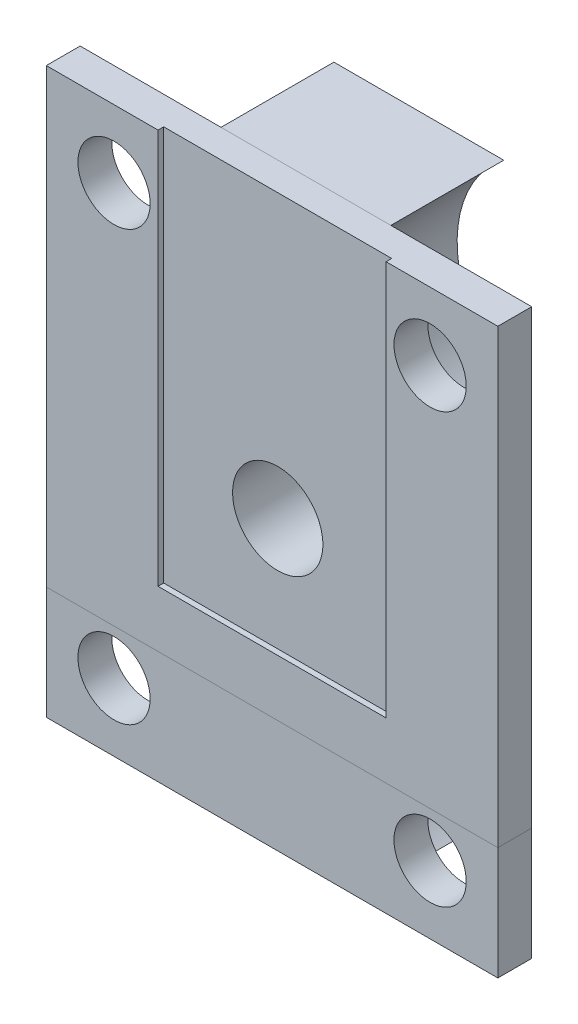
ISO-10303-21;
HEADER;
FILE_DESCRIPTION(('STEP AP214'),'2;1');
FILE_NAME('part.step','',(''),(''),'','','');
FILE_SCHEMA(('AUTOMOTIVE_DESIGN { 1 0 10303 214 1 1 1 1 }'));
ENDSEC;
DATA;
#1=APPLICATION_CONTEXT('core data for automotive mechanical design processes');
#2=APPLICATION_PROTOCOL_DEFINITION('international standard','automotive_design',2000,#1);
#3=PRODUCT_CONTEXT('',#1,'mechanical');
#4=PRODUCT('Part','Part','',(#3));
#5=PRODUCT_RELATED_PRODUCT_CATEGORY('part','',(#4));
#6=PRODUCT_DEFINITION_FORMATION('','',#4);
#7=PRODUCT_DEFINITION_CONTEXT('part definition',#1,'design');
#8=PRODUCT_DEFINITION('design','',#6,#7);
#9=PRODUCT_DEFINITION_SHAPE('','',#8);
#10=(LENGTH_UNIT() NAMED_UNIT(*) SI_UNIT(.MILLI.,.METRE.));
#11=(NAMED_UNIT(*) PLANE_ANGLE_UNIT() SI_UNIT($,.RADIAN.));
#12=(NAMED_UNIT(*) SI_UNIT($,.STERADIAN.) SOLID_ANGLE_UNIT());
#13=UNCERTAINTY_MEASURE_WITH_UNIT(LENGTH_MEASURE(1.E-05),#10,'distance_accuracy_value','');
#14=(GEOMETRIC_REPRESENTATION_CONTEXT(3) GLOBAL_UNCERTAINTY_ASSIGNED_CONTEXT((#13)) GLOBAL_UNIT_ASSIGNED_CONTEXT((#10,
#11,#12)) REPRESENTATION_CONTEXT('',''));
#15=CARTESIAN_POINT('',(0.,0.,0.));
#16=DIRECTION('',(0.,0.,1.));
#17=DIRECTION('',(1.,0.,0.));
#18=AXIS2_PLACEMENT_3D('',#15,#16,#17);
#19=CARTESIAN_POINT('',(0.,-7.5,-5.5));
#20=DIRECTION('',(0.,0.,1.));
#21=DIRECTION('',(1.,0.,0.));
#22=AXIS2_PLACEMENT_3D('',#19,#20,#21);
#23=PLANE('',#22);
#24=CARTESIAN_POINT('',(0.,-2.5,-5.5));
#25=DIRECTION('',(0.,0.,-1.));
#26=DIRECTION('',(-1.,0.,0.));
#27=AXIS2_PLACEMENT_3D('',#24,#25,#26);
#28=CIRCLE('',#27,1.35);
#29=CARTESIAN_POINT('',(-1.35,-2.5,-5.5));
#30=VERTEX_POINT('',#29);
#31=EDGE_CURVE('P0_E146',#30,#30,#28,.T.);
#32=ORIENTED_EDGE('',*,*,#31,.T.);
#33=EDGE_LOOP('',(#32));
#34=FACE_BOUND('',#33,.T.);
#35=CARTESIAN_POINT('',(0.,-2.5,-5.5));
#36=DIRECTION('',(0.,0.,-1.));
#37=DIRECTION('',(-1.,0.,0.));
#38=AXIS2_PLACEMENT_3D('',#35,#36,#37);
#39=CIRCLE('',#38,2.);
#40=CARTESIAN_POINT('',(-2.,-2.5,-5.5));
#41=VERTEX_POINT('',#40);
#42=EDGE_CURVE('P0_E19',#41,#41,#39,.F.);
#43=ORIENTED_EDGE('',*,*,#42,.T.);
#44=EDGE_LOOP('',(#43));
#45=FACE_BOUND('',#44,.T.);
#46=ADVANCED_FACE('P0_F16',(#34,#45),#23,.T.);
#47=CARTESIAN_POINT('',(0.,-2.5,-1.5));
#48=DIRECTION('',(0.,0.,-1.));
#49=DIRECTION('',(-1.,0.,0.));
#50=AXIS2_PLACEMENT_3D('',#47,#48,#49);
#51=CYLINDRICAL_SURFACE('',#50,2.);
#52=ORIENTED_EDGE('',*,*,#42,.F.);
#53=EDGE_LOOP('',(#52));
#54=FACE_BOUND('',#53,.T.);
#55=CARTESIAN_POINT('',(0.,-2.5,-0.25));
#56=DIRECTION('',(0.,0.,-1.));
#57=DIRECTION('',(-1.,0.,0.));
#58=AXIS2_PLACEMENT_3D('',#55,#56,#57);
#59=CIRCLE('',#58,2.);
#60=CARTESIAN_POINT('',(-2.,-2.5,-0.25));
#61=VERTEX_POINT('',#60);
#62=EDGE_CURVE('P0_E137',#61,#61,#59,.F.);
#63=ORIENTED_EDGE('',*,*,#62,.T.);
#64=EDGE_LOOP('',(#63));
#65=FACE_BOUND('',#64,.T.);
#66=ADVANCED_FACE('P0_F181',(#54,#65),#51,.F.);
#67=CARTESIAN_POINT('',(0.,-2.5,-6.5));
#68=DIRECTION('',(0.,0.,-1.));
#69=DIRECTION('',(-1.,0.,0.));
#70=AXIS2_PLACEMENT_3D('',#67,#68,#69);
#71=CYLINDRICAL_SURFACE('',#70,1.35);
#72=CARTESIAN_POINT('',(0.,-2.5,-6.5));
#73=DIRECTION('',(0.,0.,-1.));
#74=DIRECTION('',(-1.,0.,0.));
#75=AXIS2_PLACEMENT_3D('',#72,#73,#74);
#76=CIRCLE('',#75,1.35);
#77=CARTESIAN_POINT('',(-1.35,-2.5,-6.5));
#78=VERTEX_POINT('',#77);
#79=EDGE_CURVE('P0_E162',#78,#78,#76,.F.);
#80=ORIENTED_EDGE('',*,*,#79,.F.);
#81=EDGE_LOOP('',(#80));
#82=FACE_BOUND('',#81,.T.);
#83=ORIENTED_EDGE('',*,*,#31,.F.);
#84=EDGE_LOOP('',(#83));
#85=FACE_BOUND('',#84,.T.);
#86=ADVANCED_FACE('P0_F184',(#82,#85),#71,.F.);
#87=CARTESIAN_POINT('',(5.05,10.,0.25));
#88=DIRECTION('',(1.,0.,0.));
#89=DIRECTION('',(0.,0.,-1.));
#90=AXIS2_PLACEMENT_3D('',#87,#88,#89);
#91=PLANE('',#90);
#92=DIRECTION('',(0.,1.,0.));
#93=VECTOR('',#92,1.);
#94=CARTESIAN_POINT('',(5.05,10.,-0.25));
#95=LINE('',#94,#93);
#96=CARTESIAN_POINT('',(5.05,10.,-0.25));
#97=VERTEX_POINT('',#96);
#98=CARTESIAN_POINT('',(5.05,-7.5,-0.25));
#99=VERTEX_POINT('',#98);
#100=EDGE_CURVE('P0_E108',#97,#99,#95,.F.);
#101=ORIENTED_EDGE('',*,*,#100,.T.);
#102=DIRECTION('',(0.,0.,1.));
#103=VECTOR('',#102,1.);
#104=CARTESIAN_POINT('',(5.05,-7.5,0.));
#105=LINE('',#104,#103);
#106=CARTESIAN_POINT('',(5.05,-7.5,0.));
#107=VERTEX_POINT('',#106);
#108=EDGE_CURVE('P0_E111',#107,#99,#105,.F.);
#109=ORIENTED_EDGE('',*,*,#108,.F.);
#110=DIRECTION('',(0.,1.,0.));
#111=VECTOR('',#110,1.);
#112=CARTESIAN_POINT('',(5.05,0.,0.));
#113=LINE('',#112,#111);
#114=CARTESIAN_POINT('',(5.05,10.,0.));
#115=VERTEX_POINT('',#114);
#116=EDGE_CURVE('P0_E166',#115,#107,#113,.F.);
#117=ORIENTED_EDGE('',*,*,#116,.F.);
#118=DIRECTION('',(0.,0.,-1.));
#119=VECTOR('',#118,1.);
#120=CARTESIAN_POINT('',(5.05,10.,0.25));
#121=LINE('',#120,#119);
#122=EDGE_CURVE('P0_E113',#97,#115,#121,.F.);
#123=ORIENTED_EDGE('',*,*,#122,.F.);
#124=EDGE_LOOP('',(#101,#109,#117,#123));
#125=FACE_BOUND('',#124,.T.);
#126=ADVANCED_FACE('P0_F109',(#125),#91,.F.);
#127=CARTESIAN_POINT('',(0.,-7.5,0.));
#128=DIRECTION('',(0.,1.,0.));
#129=DIRECTION('',(0.,0.,1.));
#130=AXIS2_PLACEMENT_3D('',#127,#128,#129);
#131=PLANE('',#130);
#132=DIRECTION('',(0.,0.,1.));
#133=VECTOR('',#132,1.);
#134=CARTESIAN_POINT('',(-5.05,-7.5,-0.25));
#135=LINE('',#134,#133);
#136=CARTESIAN_POINT('',(-5.05,-7.5,-0.25));
#137=VERTEX_POINT('',#136);
#138=CARTESIAN_POINT('',(-5.05,-7.5,0.));
#139=VERTEX_POINT('',#138);
#140=EDGE_CURVE('P0_E118',#137,#139,#135,.T.);
#141=ORIENTED_EDGE('',*,*,#140,.T.);
#142=DIRECTION('',(1.,0.,0.));
#143=VECTOR('',#142,1.);
#144=CARTESIAN_POINT('',(0.,-7.5,0.));
#145=LINE('',#144,#143);
#146=EDGE_CURVE('P0_E122',#107,#139,#145,.F.);
#147=ORIENTED_EDGE('',*,*,#146,.F.);
#148=ORIENTED_EDGE('',*,*,#108,.T.);
#149=DIRECTION('',(-1.,0.,0.));
#150=VECTOR('',#149,1.);
#151=CARTESIAN_POINT('',(5.05,-7.5,-0.25));
#152=LINE('',#151,#150);
#153=EDGE_CURVE('P0_E103',#99,#137,#152,.T.);
#154=ORIENTED_EDGE('',*,*,#153,.T.);
#155=EDGE_LOOP('',(#141,#147,#148,#154));
#156=FACE_BOUND('',#155,.T.);
#157=ADVANCED_FACE('P0_F120',(#156),#131,.T.);
#158=CARTESIAN_POINT('',(-5.05,10.,-0.25));
#159=DIRECTION('',(-1.,0.,0.));
#160=DIRECTION('',(0.,0.,1.));
#161=AXIS2_PLACEMENT_3D('',#158,#159,#160);
#162=PLANE('',#161);
#163=DIRECTION('',(0.,1.,0.));
#164=VECTOR('',#163,1.);
#165=CARTESIAN_POINT('',(-5.05,10.,-0.25));
#166=LINE('',#165,#164);
#167=CARTESIAN_POINT('',(-5.05,10.,-0.25));
#168=VERTEX_POINT('',#167);
#169=EDGE_CURVE('P0_E130',#137,#168,#166,.T.);
#170=ORIENTED_EDGE('',*,*,#169,.T.);
#171=DIRECTION('',(0.,0.,1.));
#172=VECTOR('',#171,1.);
#173=CARTESIAN_POINT('',(-5.05,10.,-0.25));
#174=LINE('',#173,#172);
#175=CARTESIAN_POINT('',(-5.05,10.,0.));
#176=VERTEX_POINT('',#175);
#177=EDGE_CURVE('P0_E125',#176,#168,#174,.F.);
#178=ORIENTED_EDGE('',*,*,#177,.F.);
#179=DIRECTION('',(0.,1.,0.));
#180=VECTOR('',#179,1.);
#181=CARTESIAN_POINT('',(-5.05,0.,0.));
#182=LINE('',#181,#180);
#183=EDGE_CURVE('P0_E269',#139,#176,#182,.T.);
#184=ORIENTED_EDGE('',*,*,#183,.F.);
#185=ORIENTED_EDGE('',*,*,#140,.F.);
#186=EDGE_LOOP('',(#170,#178,#184,#185));
#187=FACE_BOUND('',#186,.T.);
#188=ADVANCED_FACE('P0_F189',(#187),#162,.F.);
#189=CARTESIAN_POINT('',(5.05,10.,-0.25));
#190=DIRECTION('',(0.,0.,-1.));
#191=DIRECTION('',(-1.,0.,0.));
#192=AXIS2_PLACEMENT_3D('',#189,#190,#191);
#193=PLANE('',#192);
#194=ORIENTED_EDGE('',*,*,#62,.F.);
#195=EDGE_LOOP('',(#194));
#196=FACE_BOUND('',#195,.T.);
#197=ORIENTED_EDGE('',*,*,#153,.F.);
#198=ORIENTED_EDGE('',*,*,#100,.F.);
#199=DIRECTION('',(1.,0.,0.));
#200=VECTOR('',#199,1.);
#201=CARTESIAN_POINT('',(0.,10.,-0.25));
#202=LINE('',#201,#200);
#203=EDGE_CURVE('P0_E268',#168,#97,#202,.T.);
#204=ORIENTED_EDGE('',*,*,#203,.F.);
#205=ORIENTED_EDGE('',*,*,#169,.F.);
#206=EDGE_LOOP('',(#197,#198,#204,#205));
#207=FACE_BOUND('',#206,.T.);
#208=ADVANCED_FACE('P0_F128',(#196,#207),#193,.F.);
#209=CARTESIAN_POINT('',(0.,-10.,-6.5));
#210=DIRECTION('',(0.,0.,-1.));
#211=DIRECTION('',(-1.,0.,0.));
#212=AXIS2_PLACEMENT_3D('',#209,#210,#211);
#213=PLANE('',#212);
#214=ORIENTED_EDGE('',*,*,#79,.T.);
#215=EDGE_LOOP('',(#214));
#216=FACE_BOUND('',#215,.T.);
#217=DIRECTION('',(0.,1.,0.));
#218=VECTOR('',#217,1.);
#219=CARTESIAN_POINT('',(-4.,-6.5,-6.5));
#220=LINE('',#219,#218);
#221=CARTESIAN_POINT('',(-4.,1.5,-6.5));
#222=VERTEX_POINT('',#221);
#223=CARTESIAN_POINT('',(-4.,-6.5,-6.5));
#224=VERTEX_POINT('',#223);
#225=EDGE_CURVE('P0_E277',#222,#224,#220,.F.);
#226=ORIENTED_EDGE('',*,*,#225,.F.);
#227=DIRECTION('',(1.,0.,0.));
#228=VECTOR('',#227,1.);
#229=CARTESIAN_POINT('',(-4.,1.5,-6.5));
#230=LINE('',#229,#228);
#231=CARTESIAN_POINT('',(4.,1.5,-6.5));
#232=VERTEX_POINT('',#231);
#233=EDGE_CURVE('P0_E324',#232,#222,#230,.F.);
#234=ORIENTED_EDGE('',*,*,#233,.F.);
#235=DIRECTION('',(0.,1.,0.));
#236=VECTOR('',#235,1.);
#237=CARTESIAN_POINT('',(4.,1.5,-6.5));
#238=LINE('',#237,#236);
#239=CARTESIAN_POINT('',(4.,-6.5,-6.5));
#240=VERTEX_POINT('',#239);
#241=EDGE_CURVE('P0_E330',#240,#232,#238,.T.);
#242=ORIENTED_EDGE('',*,*,#241,.F.);
#243=DIRECTION('',(1.,0.,0.));
#244=VECTOR('',#243,1.);
#245=CARTESIAN_POINT('',(4.,-6.5,-6.5));
#246=LINE('',#245,#244);
#247=EDGE_CURVE('P0_E337',#224,#240,#246,.T.);
#248=ORIENTED_EDGE('',*,*,#247,.F.);
#249=EDGE_LOOP('',(#226,#234,#242,#248));
#250=FACE_BOUND('',#249,.T.);
#251=ADVANCED_FACE('P0_F188',(#216,#250),#213,.T.);
#252=CARTESIAN_POINT('',(0.,0.,0.));
#253=DIRECTION('',(0.,0.,1.));
#254=DIRECTION('',(1.,0.,0.));
#255=AXIS2_PLACEMENT_3D('',#252,#253,#254);
#256=PLANE('',#255);
#257=CARTESIAN_POINT('',(-7.,7.,0.));
#258=DIRECTION('',(0.,0.,1.));
#259=DIRECTION('',(1.,0.,0.));
#260=AXIS2_PLACEMENT_3D('',#257,#258,#259);
#261=CIRCLE('',#260,1.6);
#262=CARTESIAN_POINT('',(-5.4,7.,0.));
#263=VERTEX_POINT('',#262);
#264=EDGE_CURVE('P0_E152',#263,#263,#261,.F.);
#265=ORIENTED_EDGE('',*,*,#264,.T.);
#266=EDGE_LOOP('',(#265));
#267=FACE_BOUND('',#266,.T.);
#268=CARTESIAN_POINT('',(7.,7.,0.));
#269=DIRECTION('',(0.,0.,-1.));
#270=DIRECTION('',(-1.,0.,0.));
#271=AXIS2_PLACEMENT_3D('',#268,#269,#270);
#272=CIRCLE('',#271,1.6);
#273=CARTESIAN_POINT('',(5.4,7.,0.));
#274=VERTEX_POINT('',#273);
#275=EDGE_CURVE('P0_E157',#274,#274,#272,.T.);
#276=ORIENTED_EDGE('',*,*,#275,.T.);
#277=EDGE_LOOP('',(#276));
#278=FACE_BOUND('',#277,.T.);
#279=DIRECTION('',(0.,1.,0.));
#280=VECTOR('',#279,1.);
#281=CARTESIAN_POINT('',(-10.,-10.,0.));
#282=LINE('',#281,#280);
#283=CARTESIAN_POINT('',(-10.,-10.,0.));
#284=VERTEX_POINT('',#283);
#285=CARTESIAN_POINT('',(-10.,10.,0.));
#286=VERTEX_POINT('',#285);
#287=EDGE_CURVE('P0_E257',#284,#286,#282,.T.);
#288=ORIENTED_EDGE('',*,*,#287,.F.);
#289=DIRECTION('',(1.,0.,0.));
#290=VECTOR('',#289,1.);
#291=CARTESIAN_POINT('',(0.,-10.,0.));
#292=LINE('',#291,#290);
#293=CARTESIAN_POINT('',(10.,-10.,0.));
#294=VERTEX_POINT('',#293);
#295=EDGE_CURVE('P0_E261',#284,#294,#292,.T.);
#296=ORIENTED_EDGE('',*,*,#295,.T.);
#297=DIRECTION('',(0.,1.,0.));
#298=VECTOR('',#297,1.);
#299=CARTESIAN_POINT('',(10.,-10.,0.));
#300=LINE('',#299,#298);
#301=CARTESIAN_POINT('',(10.,10.,0.));
#302=VERTEX_POINT('',#301);
#303=EDGE_CURVE('P0_E282',#302,#294,#300,.F.);
#304=ORIENTED_EDGE('',*,*,#303,.F.);
#305=DIRECTION('',(1.,0.,0.));
#306=VECTOR('',#305,1.);
#307=CARTESIAN_POINT('',(0.,10.,0.));
#308=LINE('',#307,#306);
#309=EDGE_CURVE('P0_E298',#115,#302,#308,.T.);
#310=ORIENTED_EDGE('',*,*,#309,.F.);
#311=ORIENTED_EDGE('',*,*,#116,.T.);
#312=ORIENTED_EDGE('',*,*,#146,.T.);
#313=ORIENTED_EDGE('',*,*,#183,.T.);
#314=DIRECTION('',(1.,0.,0.));
#315=VECTOR('',#314,1.);
#316=CARTESIAN_POINT('',(0.,10.,0.));
#317=LINE('',#316,#315);
#318=EDGE_CURVE('P0_E265',#286,#176,#317,.T.);
#319=ORIENTED_EDGE('',*,*,#318,.F.);
#320=EDGE_LOOP('',(#288,#296,#304,#310,#311,#312,#313,#319));
#321=FACE_BOUND('',#320,.T.);
#322=ADVANCED_FACE('P0_F196',(#267,#278,#321),#256,.T.);
#323=CARTESIAN_POINT('',(-10.,-10.,-1.5));
#324=DIRECTION('',(-1.,0.,0.));
#325=DIRECTION('',(0.,0.,1.));
#326=AXIS2_PLACEMENT_3D('',#323,#324,#325);
#327=PLANE('',#326);
#328=DIRECTION('',(0.,0.,1.));
#329=VECTOR('',#328,1.);
#330=CARTESIAN_POINT('',(-10.,-10.,0.));
#331=LINE('',#330,#329);
#332=CARTESIAN_POINT('',(-10.,-10.,-1.5));
#333=VERTEX_POINT('',#332);
#334=EDGE_CURVE('P0_E272',#333,#284,#331,.T.);
#335=ORIENTED_EDGE('',*,*,#334,.T.);
#336=ORIENTED_EDGE('',*,*,#287,.T.);
#337=DIRECTION('',(0.,0.,1.));
#338=VECTOR('',#337,1.);
#339=CARTESIAN_POINT('',(-10.,10.,0.));
#340=LINE('',#339,#338);
#341=CARTESIAN_POINT('',(-10.,10.,-1.5));
#342=VERTEX_POINT('',#341);
#343=EDGE_CURVE('P0_E295',#342,#286,#340,.T.);
#344=ORIENTED_EDGE('',*,*,#343,.F.);
#345=DIRECTION('',(0.,1.,0.));
#346=VECTOR('',#345,1.);
#347=CARTESIAN_POINT('',(-10.,-10.,-1.5));
#348=LINE('',#347,#346);
#349=EDGE_CURVE('P0_E156',#333,#342,#348,.T.);
#350=ORIENTED_EDGE('',*,*,#349,.F.);
#351=EDGE_LOOP('',(#335,#336,#344,#350));
#352=FACE_BOUND('',#351,.T.);
#353=ADVANCED_FACE('P0_F243',(#352),#327,.T.);
#354=CARTESIAN_POINT('',(0.,10.,0.));
#355=DIRECTION('',(0.,1.,0.));
#356=DIRECTION('',(0.,0.,1.));
#357=AXIS2_PLACEMENT_3D('',#354,#355,#356);
#358=PLANE('',#357);
#359=ORIENTED_EDGE('',*,*,#343,.T.);
#360=ORIENTED_EDGE('',*,*,#318,.T.);
#361=ORIENTED_EDGE('',*,*,#177,.T.);
#362=ORIENTED_EDGE('',*,*,#203,.T.);
#363=ORIENTED_EDGE('',*,*,#122,.T.);
#364=ORIENTED_EDGE('',*,*,#309,.T.);
#365=DIRECTION('',(0.,0.,-1.));
#366=VECTOR('',#365,1.);
#367=CARTESIAN_POINT('',(10.,10.,1.5));
#368=LINE('',#367,#366);
#369=CARTESIAN_POINT('',(10.,10.,-1.5));
#370=VERTEX_POINT('',#369);
#371=EDGE_CURVE('P0_E287',#370,#302,#368,.F.);
#372=ORIENTED_EDGE('',*,*,#371,.F.);
#373=DIRECTION('',(-1.,0.,0.));
#374=VECTOR('',#373,1.);
#375=CARTESIAN_POINT('',(10.,10.,-1.5));
#376=LINE('',#375,#374);
#377=EDGE_CURVE('P0_E311',#342,#370,#376,.F.);
#378=ORIENTED_EDGE('',*,*,#377,.F.);
#379=EDGE_LOOP('',(#359,#360,#361,#362,#363,#364,#372,#378));
#380=FACE_BOUND('',#379,.T.);
#381=ADVANCED_FACE('P0_F239',(#380),#358,.T.);
#382=CARTESIAN_POINT('',(10.,-10.,1.5));
#383=DIRECTION('',(1.,0.,0.));
#384=DIRECTION('',(0.,0.,-1.));
#385=AXIS2_PLACEMENT_3D('',#382,#383,#384);
#386=PLANE('',#385);
#387=ORIENTED_EDGE('',*,*,#371,.T.);
#388=ORIENTED_EDGE('',*,*,#303,.T.);
#389=DIRECTION('',(0.,0.,1.));
#390=VECTOR('',#389,1.);
#391=CARTESIAN_POINT('',(10.,-10.,0.));
#392=LINE('',#391,#390);
#393=CARTESIAN_POINT('',(10.,-10.,-1.5));
#394=VERTEX_POINT('',#393);
#395=EDGE_CURVE('P0_E278',#294,#394,#392,.F.);
#396=ORIENTED_EDGE('',*,*,#395,.T.);
#397=DIRECTION('',(0.,1.,0.));
#398=VECTOR('',#397,1.);
#399=CARTESIAN_POINT('',(10.,-10.,-1.5));
#400=LINE('',#399,#398);
#401=EDGE_CURVE('P0_E315',#370,#394,#400,.F.);
#402=ORIENTED_EDGE('',*,*,#401,.F.);
#403=EDGE_LOOP('',(#387,#388,#396,#402));
#404=FACE_BOUND('',#403,.T.);
#405=ADVANCED_FACE('P0_F235',(#404),#386,.T.);
#406=CARTESIAN_POINT('',(0.,-10.,0.));
#407=DIRECTION('',(0.,1.,0.));
#408=DIRECTION('',(0.,0.,1.));
#409=AXIS2_PLACEMENT_3D('',#406,#407,#408);
#410=PLANE('',#409);
#411=DIRECTION('',(-1.,0.,0.));
#412=VECTOR('',#411,1.);
#413=CARTESIAN_POINT('',(10.,-10.,-1.5));
#414=LINE('',#413,#412);
#415=EDGE_CURVE('P0_E317',#394,#333,#414,.T.);
#416=ORIENTED_EDGE('',*,*,#415,.F.);
#417=ORIENTED_EDGE('',*,*,#395,.F.);
#418=ORIENTED_EDGE('',*,*,#295,.F.);
#419=ORIENTED_EDGE('',*,*,#334,.F.);
#420=EDGE_LOOP('',(#416,#417,#418,#419));
#421=FACE_BOUND('',#420,.T.);
#422=ADVANCED_FACE('P0_F231',(#421),#410,.F.);
#423=CARTESIAN_POINT('',(-4.,-6.5,-1.5));
#424=DIRECTION('',(-1.,0.,0.));
#425=DIRECTION('',(0.,0.,1.));
#426=AXIS2_PLACEMENT_3D('',#423,#424,#425);
#427=PLANE('',#426);
#428=DIRECTION('',(0.,0.,-1.));
#429=VECTOR('',#428,1.);
#430=CARTESIAN_POINT('',(-4.,-6.5,-1.5));
#431=LINE('',#430,#429);
#432=CARTESIAN_POINT('',(-4.,-6.5,-1.5));
#433=VERTEX_POINT('',#432);
#434=EDGE_CURVE('P0_E340',#433,#224,#431,.T.);
#435=ORIENTED_EDGE('',*,*,#434,.F.);
#436=DIRECTION('',(0.,1.,0.));
#437=VECTOR('',#436,1.);
#438=CARTESIAN_POINT('',(-4.,-10.,-1.5));
#439=LINE('',#438,#437);
#440=CARTESIAN_POINT('',(-4.,1.5,-1.5));
#441=VERTEX_POINT('',#440);
#442=EDGE_CURVE('P0_E355',#441,#433,#439,.F.);
#443=ORIENTED_EDGE('',*,*,#442,.F.);
#444=DIRECTION('',(0.,0.,1.));
#445=VECTOR('',#444,1.);
#446=CARTESIAN_POINT('',(-4.,1.5,-1.5));
#447=LINE('',#446,#445);
#448=EDGE_CURVE('P0_E161',#222,#441,#447,.T.);
#449=ORIENTED_EDGE('',*,*,#448,.F.);
#450=ORIENTED_EDGE('',*,*,#225,.T.);
#451=EDGE_LOOP('',(#435,#443,#449,#450));
#452=FACE_BOUND('',#451,.T.);
#453=ADVANCED_FACE('P0_F227',(#452),#427,.T.);
#454=CARTESIAN_POINT('',(4.,-6.5,-1.5));
#455=DIRECTION('',(0.,-1.,0.));
#456=DIRECTION('',(0.,0.,-1.));
#457=AXIS2_PLACEMENT_3D('',#454,#455,#456);
#458=PLANE('',#457);
#459=DIRECTION('',(0.,0.,-1.));
#460=VECTOR('',#459,1.);
#461=CARTESIAN_POINT('',(4.,-6.5,-1.5));
#462=LINE('',#461,#460);
#463=CARTESIAN_POINT('',(4.,-6.5,-1.5));
#464=VERTEX_POINT('',#463);
#465=EDGE_CURVE('P0_E333',#464,#240,#462,.T.);
#466=ORIENTED_EDGE('',*,*,#465,.F.);
#467=DIRECTION('',(-1.,0.,0.));
#468=VECTOR('',#467,1.);
#469=CARTESIAN_POINT('',(10.,-6.5,-1.5));
#470=LINE('',#469,#468);
#471=EDGE_CURVE('P0_E350',#433,#464,#470,.F.);
#472=ORIENTED_EDGE('',*,*,#471,.F.);
#473=ORIENTED_EDGE('',*,*,#434,.T.);
#474=ORIENTED_EDGE('',*,*,#247,.T.);
#475=EDGE_LOOP('',(#466,#472,#473,#474));
#476=FACE_BOUND('',#475,.T.);
#477=ADVANCED_FACE('P0_F224',(#476),#458,.T.);
#478=CARTESIAN_POINT('',(4.,1.5,-1.5));
#479=DIRECTION('',(1.,0.,0.));
#480=DIRECTION('',(0.,0.,-1.));
#481=AXIS2_PLACEMENT_3D('',#478,#479,#480);
#482=PLANE('',#481);
#483=DIRECTION('',(0.,0.,1.));
#484=VECTOR('',#483,1.);
#485=CARTESIAN_POINT('',(4.,1.5,-1.5));
#486=LINE('',#485,#484);
#487=CARTESIAN_POINT('',(4.,1.5,-1.5));
#488=VERTEX_POINT('',#487);
#489=EDGE_CURVE('P0_E35',#488,#232,#486,.F.);
#490=ORIENTED_EDGE('',*,*,#489,.F.);
#491=DIRECTION('',(0.,1.,0.));
#492=VECTOR('',#491,1.);
#493=CARTESIAN_POINT('',(4.,-10.,-1.5));
#494=LINE('',#493,#492);
#495=EDGE_CURVE('P0_E354',#464,#488,#494,.T.);
#496=ORIENTED_EDGE('',*,*,#495,.F.);
#497=ORIENTED_EDGE('',*,*,#465,.T.);
#498=ORIENTED_EDGE('',*,*,#241,.T.);
#499=EDGE_LOOP('',(#490,#496,#497,#498));
#500=FACE_BOUND('',#499,.T.);
#501=ADVANCED_FACE('P0_F220',(#500),#482,.T.);
#502=CARTESIAN_POINT('',(-4.,1.5,-1.5));
#503=DIRECTION('',(0.,1.,0.));
#504=DIRECTION('',(0.,0.,1.));
#505=AXIS2_PLACEMENT_3D('',#502,#503,#504);
#506=PLANE('',#505);
#507=ORIENTED_EDGE('',*,*,#448,.T.);
#508=DIRECTION('',(-1.,0.,0.));
#509=VECTOR('',#508,1.);
#510=CARTESIAN_POINT('',(10.,1.5,-1.5));
#511=LINE('',#510,#509);
#512=EDGE_CURVE('P0_E151',#488,#441,#511,.T.);
#513=ORIENTED_EDGE('',*,*,#512,.F.);
#514=ORIENTED_EDGE('',*,*,#489,.T.);
#515=ORIENTED_EDGE('',*,*,#233,.T.);
#516=EDGE_LOOP('',(#507,#513,#514,#515));
#517=FACE_BOUND('',#516,.T.);
#518=ADVANCED_FACE('P0_F216',(#517),#506,.T.);
#519=CARTESIAN_POINT('',(7.,7.,0.));
#520=DIRECTION('',(0.,0.,-1.));
#521=DIRECTION('',(-1.,0.,0.));
#522=AXIS2_PLACEMENT_3D('',#519,#520,#521);
#523=CYLINDRICAL_SURFACE('',#522,1.6);
#524=ORIENTED_EDGE('',*,*,#275,.F.);
#525=EDGE_LOOP('',(#524));
#526=FACE_BOUND('',#525,.T.);
#527=CARTESIAN_POINT('',(7.,7.,-1.5));
#528=DIRECTION('',(0.,0.,-1.));
#529=DIRECTION('',(-1.,0.,0.));
#530=AXIS2_PLACEMENT_3D('',#527,#528,#529);
#531=CIRCLE('',#530,1.6);
#532=CARTESIAN_POINT('',(5.4,7.,-1.5));
#533=VERTEX_POINT('',#532);
#534=EDGE_CURVE('P0_E26',#533,#533,#531,.F.);
#535=ORIENTED_EDGE('',*,*,#534,.F.);
#536=EDGE_LOOP('',(#535));
#537=FACE_BOUND('',#536,.T.);
#538=ADVANCED_FACE('P0_F209',(#526,#537),#523,.F.);
#539=CARTESIAN_POINT('',(-7.,7.,0.));
#540=DIRECTION('',(0.,0.,1.));
#541=DIRECTION('',(1.,0.,0.));
#542=AXIS2_PLACEMENT_3D('',#539,#540,#541);
#543=CYLINDRICAL_SURFACE('',#542,1.6);
#544=ORIENTED_EDGE('',*,*,#264,.F.);
#545=EDGE_LOOP('',(#544));
#546=FACE_BOUND('',#545,.T.);
#547=CARTESIAN_POINT('',(-7.,7.,-1.5));
#548=DIRECTION('',(0.,0.,1.));
#549=DIRECTION('',(1.,0.,0.));
#550=AXIS2_PLACEMENT_3D('',#547,#548,#549);
#551=CIRCLE('',#550,1.6);
#552=CARTESIAN_POINT('',(-5.4,7.,-1.5));
#553=VERTEX_POINT('',#552);
#554=EDGE_CURVE('P0_E11',#553,#553,#551,.T.);
#555=ORIENTED_EDGE('',*,*,#554,.F.);
#556=EDGE_LOOP('',(#555));
#557=FACE_BOUND('',#556,.T.);
#558=ADVANCED_FACE('P0_F203',(#546,#557),#543,.F.);
#559=CARTESIAN_POINT('',(10.,-10.,-1.5));
#560=DIRECTION('',(0.,0.,-1.));
#561=DIRECTION('',(-1.,0.,0.));
#562=AXIS2_PLACEMENT_3D('',#559,#560,#561);
#563=PLANE('',#562);
#564=ORIENTED_EDGE('',*,*,#554,.T.);
#565=EDGE_LOOP('',(#564));
#566=FACE_BOUND('',#565,.T.);
#567=ORIENTED_EDGE('',*,*,#534,.T.);
#568=EDGE_LOOP('',(#567));
#569=FACE_BOUND('',#568,.T.);
#570=ORIENTED_EDGE('',*,*,#495,.T.);
#571=ORIENTED_EDGE('',*,*,#512,.T.);
#572=ORIENTED_EDGE('',*,*,#442,.T.);
#573=ORIENTED_EDGE('',*,*,#471,.T.);
#574=EDGE_LOOP('',(#570,#571,#572,#573));
#575=FACE_BOUND('',#574,.T.);
#576=ORIENTED_EDGE('',*,*,#401,.T.);
#577=ORIENTED_EDGE('',*,*,#415,.T.);
#578=ORIENTED_EDGE('',*,*,#349,.T.);
#579=ORIENTED_EDGE('',*,*,#377,.T.);
#580=EDGE_LOOP('',(#576,#577,#578,#579));
#581=FACE_BOUND('',#580,.T.);
#582=ADVANCED_FACE('P0_F201',(#566,#569,#575,#581),#563,.T.);
#583=CLOSED_SHELL('',(#46,#66,#86,#126,#157,#188,#208,#251,#322,#353,#381,#405,#422,#453,#477,
#501,#518,#538,#558,#582));
#584=MANIFOLD_SOLID_BREP('P0_B1',#583);
#585=CARTESIAN_POINT('',(10.,-10.,-1.5));
#586=DIRECTION('',(1.,0.,0.));
#587=DIRECTION('',(0.,0.,-1.));
#588=AXIS2_PLACEMENT_3D('',#585,#586,#587);
#589=PLANE('',#588);
#590=DIRECTION('',(0.,1.,0.));
#591=VECTOR('',#590,1.);
#592=CARTESIAN_POINT('',(10.,-10.,-1.5));
#593=LINE('',#592,#591);
#594=CARTESIAN_POINT('',(10.,-10.,-1.5));
#595=VERTEX_POINT('',#594);
#596=CARTESIAN_POINT('',(10.,-15.,-1.5));
#597=VERTEX_POINT('',#596);
#598=EDGE_CURVE('P1_E220',#595,#597,#593,.F.);
#599=ORIENTED_EDGE('',*,*,#598,.F.);
#600=DIRECTION('',(0.,0.,-1.));
#601=VECTOR('',#600,1.);
#602=CARTESIAN_POINT('',(10.,-10.,0.));
#603=LINE('',#602,#601);
#604=CARTESIAN_POINT('',(10.,-10.,0.));
#605=VERTEX_POINT('',#604);
#606=EDGE_CURVE('P1_E135',#595,#605,#603,.F.);
#607=ORIENTED_EDGE('',*,*,#606,.T.);
#608=DIRECTION('',(0.,1.,0.));
#609=VECTOR('',#608,1.);
#610=CARTESIAN_POINT('',(10.,-10.,0.));
#611=LINE('',#610,#609);
#612=CARTESIAN_POINT('',(10.,-15.,0.));
#613=VERTEX_POINT('',#612);
#614=EDGE_CURVE('P1_E134',#613,#605,#611,.T.);
#615=ORIENTED_EDGE('',*,*,#614,.F.);
#616=DIRECTION('',(0.,0.,-1.));
#617=VECTOR('',#616,1.);
#618=CARTESIAN_POINT('',(10.,-15.,-1.5));
#619=LINE('',#618,#617);
#620=EDGE_CURVE('P1_E119',#613,#597,#619,.T.);
#621=ORIENTED_EDGE('',*,*,#620,.T.);
#622=EDGE_LOOP('',(#599,#607,#615,#621));
#623=FACE_BOUND('',#622,.T.);
#624=ADVANCED_FACE('P1_F16',(#623),#589,.T.);
#625=CARTESIAN_POINT('',(7.,-12.,0.));
#626=DIRECTION('',(0.,0.,-1.));
#627=DIRECTION('',(-1.,0.,0.));
#628=AXIS2_PLACEMENT_3D('',#625,#626,#627);
#629=CYLINDRICAL_SURFACE('',#628,1.6);
#630=CARTESIAN_POINT('',(7.,-12.,0.));
#631=DIRECTION('',(0.,0.,-1.));
#632=DIRECTION('',(-1.,0.,0.));
#633=AXIS2_PLACEMENT_3D('',#630,#631,#632);
#634=CIRCLE('',#633,1.6);
#635=CARTESIAN_POINT('',(5.4,-12.,0.));
#636=VERTEX_POINT('',#635);
#637=EDGE_CURVE('P1_E19',#636,#636,#634,.T.);
#638=ORIENTED_EDGE('',*,*,#637,.F.);
#639=EDGE_LOOP('',(#638));
#640=FACE_BOUND('',#639,.T.);
#641=CARTESIAN_POINT('',(7.,-12.,-1.5));
#642=DIRECTION('',(0.,0.,-1.));
#643=DIRECTION('',(-1.,0.,0.));
#644=AXIS2_PLACEMENT_3D('',#641,#642,#643);
#645=CIRCLE('',#644,1.6);
#646=CARTESIAN_POINT('',(5.4,-12.,-1.5));
#647=VERTEX_POINT('',#646);
#648=EDGE_CURVE('P1_E216',#647,#647,#645,.F.);
#649=ORIENTED_EDGE('',*,*,#648,.F.);
#650=EDGE_LOOP('',(#649));
#651=FACE_BOUND('',#650,.T.);
#652=ADVANCED_FACE('P1_F399',(#640,#651),#629,.F.);
#653=CARTESIAN_POINT('',(-10.,-10.,0.));
#654=DIRECTION('',(-1.,0.,0.));
#655=DIRECTION('',(0.,0.,1.));
#656=AXIS2_PLACEMENT_3D('',#653,#654,#655);
#657=PLANE('',#656);
#658=DIRECTION('',(0.,1.,0.));
#659=VECTOR('',#658,1.);
#660=CARTESIAN_POINT('',(-10.,-10.,0.));
#661=LINE('',#660,#659);
#662=CARTESIAN_POINT('',(-10.,-10.,0.));
#663=VERTEX_POINT('',#662);
#664=CARTESIAN_POINT('',(-10.,-15.,0.));
#665=VERTEX_POINT('',#664);
#666=EDGE_CURVE('P1_E141',#663,#665,#661,.F.);
#667=ORIENTED_EDGE('',*,*,#666,.F.);
#668=DIRECTION('',(0.,0.,-1.));
#669=VECTOR('',#668,1.);
#670=CARTESIAN_POINT('',(-10.,-10.,0.));
#671=LINE('',#670,#669);
#672=CARTESIAN_POINT('',(-10.,-10.,-1.5));
#673=VERTEX_POINT('',#672);
#674=EDGE_CURVE('P1_E98',#663,#673,#671,.T.);
#675=ORIENTED_EDGE('',*,*,#674,.T.);
#676=DIRECTION('',(0.,1.,0.));
#677=VECTOR('',#676,1.);
#678=CARTESIAN_POINT('',(-10.,-10.,-1.5));
#679=LINE('',#678,#677);
#680=CARTESIAN_POINT('',(-10.,-15.,-1.5));
#681=VERTEX_POINT('',#680);
#682=EDGE_CURVE('P1_E219',#681,#673,#679,.T.);
#683=ORIENTED_EDGE('',*,*,#682,.F.);
#684=DIRECTION('',(0.,0.,1.));
#685=VECTOR('',#684,1.);
#686=CARTESIAN_POINT('',(-10.,-15.,0.));
#687=LINE('',#686,#685);
#688=EDGE_CURVE('P1_E131',#681,#665,#687,.T.);
#689=ORIENTED_EDGE('',*,*,#688,.T.);
#690=EDGE_LOOP('',(#667,#675,#683,#689));
#691=FACE_BOUND('',#690,.T.);
#692=ADVANCED_FACE('P1_F396',(#691),#657,.T.);
#693=CARTESIAN_POINT('',(-7.,-12.,0.));
#694=DIRECTION('',(0.,0.,1.));
#695=DIRECTION('',(1.,0.,0.));
#696=AXIS2_PLACEMENT_3D('',#693,#694,#695);
#697=CYLINDRICAL_SURFACE('',#696,1.6);
#698=CARTESIAN_POINT('',(-7.,-12.,0.));
#699=DIRECTION('',(0.,0.,1.));
#700=DIRECTION('',(1.,0.,0.));
#701=AXIS2_PLACEMENT_3D('',#698,#699,#700);
#702=CIRCLE('',#701,1.6);
#703=CARTESIAN_POINT('',(-5.4,-12.,0.));
#704=VERTEX_POINT('',#703);
#705=EDGE_CURVE('P1_E221',#704,#704,#702,.F.);
#706=ORIENTED_EDGE('',*,*,#705,.F.);
#707=EDGE_LOOP('',(#706));
#708=FACE_BOUND('',#707,.T.);
#709=CARTESIAN_POINT('',(-7.,-12.,-1.5));
#710=DIRECTION('',(0.,0.,1.));
#711=DIRECTION('',(1.,0.,0.));
#712=AXIS2_PLACEMENT_3D('',#709,#710,#711);
#713=CIRCLE('',#712,1.6);
#714=CARTESIAN_POINT('',(-5.4,-12.,-1.5));
#715=VERTEX_POINT('',#714);
#716=EDGE_CURVE('P1_E211',#715,#715,#713,.T.);
#717=ORIENTED_EDGE('',*,*,#716,.F.);
#718=EDGE_LOOP('',(#717));
#719=FACE_BOUND('',#718,.T.);
#720=ADVANCED_FACE('P1_F392',(#708,#719),#697,.F.);
#721=CARTESIAN_POINT('',(0.,-10.,0.));
#722=DIRECTION('',(0.,-1.,0.));
#723=DIRECTION('',(0.,0.,-1.));
#724=AXIS2_PLACEMENT_3D('',#721,#722,#723);
#725=PLANE('',#724);
#726=ORIENTED_EDGE('',*,*,#674,.F.);
#727=DIRECTION('',(1.,0.,0.));
#728=VECTOR('',#727,1.);
#729=CARTESIAN_POINT('',(10.,-10.,0.));
#730=LINE('',#729,#728);
#731=EDGE_CURVE('P1_E140',#605,#663,#730,.F.);
#732=ORIENTED_EDGE('',*,*,#731,.F.);
#733=ORIENTED_EDGE('',*,*,#606,.F.);
#734=DIRECTION('',(-1.,0.,0.));
#735=VECTOR('',#734,1.);
#736=CARTESIAN_POINT('',(-10.,-10.,-1.5));
#737=LINE('',#736,#735);
#738=CARTESIAN_POINT('',(1.76411480743164,-10.,-1.5));
#739=VERTEX_POINT('',#738);
#740=EDGE_CURVE('P1_E224',#739,#595,#737,.F.);
#741=ORIENTED_EDGE('',*,*,#740,.F.);
#742=DIRECTION('',(-1.,0.,0.));
#743=VECTOR('',#742,1.);
#744=CARTESIAN_POINT('',(0.,-10.,-1.5));
#745=LINE('',#744,#743);
#746=CARTESIAN_POINT('',(-1.76411480743164,-10.,-1.5));
#747=VERTEX_POINT('',#746);
#748=EDGE_CURVE('P1_E210',#739,#747,#745,.T.);
#749=ORIENTED_EDGE('',*,*,#748,.T.);
#750=DIRECTION('',(-1.,0.,0.));
#751=VECTOR('',#750,1.);
#752=CARTESIAN_POINT('',(-10.,-10.,-1.5));
#753=LINE('',#752,#751);
#754=EDGE_CURVE('P1_E215',#673,#747,#753,.F.);
#755=ORIENTED_EDGE('',*,*,#754,.F.);
#756=EDGE_LOOP('',(#726,#732,#733,#741,#749,#755));
#757=FACE_BOUND('',#756,.T.);
#758=ADVANCED_FACE('P1_F389',(#757),#725,.F.);
#759=CARTESIAN_POINT('',(10.,-10.,0.));
#760=DIRECTION('',(0.,0.,1.));
#761=DIRECTION('',(1.,0.,0.));
#762=AXIS2_PLACEMENT_3D('',#759,#760,#761);
#763=PLANE('',#762);
#764=ORIENTED_EDGE('',*,*,#705,.T.);
#765=EDGE_LOOP('',(#764));
#766=FACE_BOUND('',#765,.T.);
#767=ORIENTED_EDGE('',*,*,#637,.T.);
#768=EDGE_LOOP('',(#767));
#769=FACE_BOUND('',#768,.T.);
#770=ORIENTED_EDGE('',*,*,#614,.T.);
#771=ORIENTED_EDGE('',*,*,#731,.T.);
#772=ORIENTED_EDGE('',*,*,#666,.T.);
#773=DIRECTION('',(1.,0.,0.));
#774=VECTOR('',#773,1.);
#775=CARTESIAN_POINT('',(0.,-15.,0.));
#776=LINE('',#775,#774);
#777=EDGE_CURVE('P1_E124',#613,#665,#776,.F.);
#778=ORIENTED_EDGE('',*,*,#777,.F.);
#779=EDGE_LOOP('',(#770,#771,#772,#778));
#780=FACE_BOUND('',#779,.T.);
#781=ADVANCED_FACE('P1_F144',(#766,#769,#780),#763,.T.);
#782=CARTESIAN_POINT('',(-10.,-10.,-1.5));
#783=DIRECTION('',(0.,0.,-1.));
#784=DIRECTION('',(-1.,0.,0.));
#785=AXIS2_PLACEMENT_3D('',#782,#783,#784);
#786=PLANE('',#785);
#787=ORIENTED_EDGE('',*,*,#648,.T.);
#788=EDGE_LOOP('',(#787));
#789=FACE_BOUND('',#788,.T.);
#790=DIRECTION('',(1.,0.,0.));
#791=VECTOR('',#790,1.);
#792=CARTESIAN_POINT('',(0.,-15.,-1.5));
#793=LINE('',#792,#791);
#794=CARTESIAN_POINT('',(3.76112513885912,-15.,-1.5));
#795=VERTEX_POINT('',#794);
#796=EDGE_CURVE('P1_E126',#795,#597,#793,.T.);
#797=ORIENTED_EDGE('',*,*,#796,.F.);
#798=CARTESIAN_POINT('',(6.929629701077,-10.83568770443,-1.5));
#799=DIRECTION('',(0.,0.,-1.));
#800=DIRECTION('',(-1.,0.,0.));
#801=AXIS2_PLACEMENT_3D('',#798,#799,#800);
#802=CIRCLE('',#801,5.232677904841);
#803=EDGE_CURVE('P1_E202',#795,#739,#802,.T.);
#804=ORIENTED_EDGE('',*,*,#803,.T.);
#805=ORIENTED_EDGE('',*,*,#740,.T.);
#806=ORIENTED_EDGE('',*,*,#598,.T.);
#807=EDGE_LOOP('',(#797,#804,#805,#806));
#808=FACE_BOUND('',#807,.T.);
#809=ADVANCED_FACE('P1_F379',(#789,#808),#786,.T.);
#810=CARTESIAN_POINT('',(-10.,-10.,-1.5));
#811=DIRECTION('',(0.,0.,-1.));
#812=DIRECTION('',(-1.,0.,0.));
#813=AXIS2_PLACEMENT_3D('',#810,#811,#812);
#814=PLANE('',#813);
#815=ORIENTED_EDGE('',*,*,#716,.T.);
#816=EDGE_LOOP('',(#815));
#817=FACE_BOUND('',#816,.T.);
#818=ORIENTED_EDGE('',*,*,#754,.T.);
#819=CARTESIAN_POINT('',(-6.929629701077,-10.83568770443,-1.5));
#820=DIRECTION('',(0.,0.,-1.));
#821=DIRECTION('',(-1.,0.,0.));
#822=AXIS2_PLACEMENT_3D('',#819,#820,#821);
#823=CIRCLE('',#822,5.232677904841);
#824=CARTESIAN_POINT('',(-3.76112513886027,-14.9999999999985,-1.5));
#825=VERTEX_POINT('',#824);
#826=EDGE_CURVE('P1_E197',#747,#825,#823,.T.);
#827=ORIENTED_EDGE('',*,*,#826,.T.);
#828=DIRECTION('',(1.,0.,0.));
#829=VECTOR('',#828,1.);
#830=CARTESIAN_POINT('',(0.,-15.,-1.5));
#831=LINE('',#830,#829);
#832=EDGE_CURVE('P1_E146',#681,#825,#831,.T.);
#833=ORIENTED_EDGE('',*,*,#832,.F.);
#834=ORIENTED_EDGE('',*,*,#682,.T.);
#835=EDGE_LOOP('',(#818,#827,#833,#834));
#836=FACE_BOUND('',#835,.T.);
#837=ADVANCED_FACE('P1_F372',(#817,#836),#814,.T.);
#838=CARTESIAN_POINT('',(0.,-10.,-1.5));
#839=DIRECTION('',(0.,0.,-1.));
#840=DIRECTION('',(-1.,0.,0.));
#841=AXIS2_PLACEMENT_3D('',#838,#839,#840);
#842=PLANE('',#841);
#843=CARTESIAN_POINT('',(0.,-2.5,-1.5));
#844=DIRECTION('',(0.,0.,-1.));
#845=DIRECTION('',(-1.,0.,0.));
#846=AXIS2_PLACEMENT_3D('',#843,#844,#845);
#847=CIRCLE('',#846,2.25);
#848=CARTESIAN_POINT('',(-2.25,-2.5,-1.5));
#849=VERTEX_POINT('',#848);
#850=EDGE_CURVE('P1_E181',#849,#849,#847,.T.);
#851=ORIENTED_EDGE('',*,*,#850,.T.);
#852=EDGE_LOOP('',(#851));
#853=FACE_BOUND('',#852,.T.);
#854=DIRECTION('',(0.,1.,0.));
#855=VECTOR('',#854,1.);
#856=CARTESIAN_POINT('',(4.,1.5,-1.5));
#857=LINE('',#856,#855);
#858=CARTESIAN_POINT('',(4.,1.50000000000009,-1.5));
#859=VERTEX_POINT('',#858);
#860=CARTESIAN_POINT('',(3.99999999999911,-6.49999999999677,-1.5));
#861=VERTEX_POINT('',#860);
#862=EDGE_CURVE('P1_E206',#859,#861,#857,.F.);
#863=ORIENTED_EDGE('',*,*,#862,.F.);
#864=CARTESIAN_POINT('',(6.929629701077,5.835687704434,-1.5));
#865=DIRECTION('',(0.,0.,-1.));
#866=DIRECTION('',(-1.,0.,0.));
#867=AXIS2_PLACEMENT_3D('',#864,#865,#866);
#868=CIRCLE('',#867,5.232677904841);
#869=CARTESIAN_POINT('',(3.76112513885649,10.,-1.5));
#870=VERTEX_POINT('',#869);
#871=EDGE_CURVE('P1_E89',#859,#870,#868,.T.);
#872=ORIENTED_EDGE('',*,*,#871,.T.);
#873=DIRECTION('',(1.,0.,0.));
#874=VECTOR('',#873,1.);
#875=CARTESIAN_POINT('',(-3.761125138856,10.,-1.5));
#876=LINE('',#875,#874);
#877=CARTESIAN_POINT('',(-3.76112513885649,10.,-1.5));
#878=VERTEX_POINT('',#877);
#879=EDGE_CURVE('P1_E185',#878,#870,#876,.T.);
#880=ORIENTED_EDGE('',*,*,#879,.F.);
#881=CARTESIAN_POINT('',(-6.929629701077,5.835687704434,-1.5));
#882=DIRECTION('',(0.,0.,-1.));
#883=DIRECTION('',(-1.,0.,0.));
#884=AXIS2_PLACEMENT_3D('',#881,#882,#883);
#885=CIRCLE('',#884,5.232677904841);
#886=CARTESIAN_POINT('',(-4.00000000000004,1.50000000000014,-1.5));
#887=VERTEX_POINT('',#886);
#888=EDGE_CURVE('P1_E186',#878,#887,#885,.T.);
#889=ORIENTED_EDGE('',*,*,#888,.T.);
#890=DIRECTION('',(0.,1.,0.));
#891=VECTOR('',#890,1.);
#892=CARTESIAN_POINT('',(-4.,-6.5,-1.5));
#893=LINE('',#892,#891);
#894=CARTESIAN_POINT('',(-4.,-6.49999999999809,-1.5));
#895=VERTEX_POINT('',#894);
#896=EDGE_CURVE('P1_E190',#895,#887,#893,.T.);
#897=ORIENTED_EDGE('',*,*,#896,.F.);
#898=CARTESIAN_POINT('',(-6.929629701077,-10.83568770443,-1.5));
#899=DIRECTION('',(0.,0.,-1.));
#900=DIRECTION('',(-1.,0.,0.));
#901=AXIS2_PLACEMENT_3D('',#898,#899,#900);
#902=CIRCLE('',#901,5.232677904841);
#903=EDGE_CURVE('P1_E191',#895,#747,#902,.T.);
#904=ORIENTED_EDGE('',*,*,#903,.T.);
#905=ORIENTED_EDGE('',*,*,#748,.F.);
#906=CARTESIAN_POINT('',(6.929629701077,-10.83568770443,-1.5));
#907=DIRECTION('',(0.,0.,-1.));
#908=DIRECTION('',(-1.,0.,0.));
#909=AXIS2_PLACEMENT_3D('',#906,#907,#908);
#910=CIRCLE('',#909,5.232677904841);
#911=EDGE_CURVE('P1_E156',#739,#861,#910,.T.);
#912=ORIENTED_EDGE('',*,*,#911,.T.);
#913=EDGE_LOOP('',(#863,#872,#880,#889,#897,#904,#905,#912));
#914=FACE_BOUND('',#913,.T.);
#915=ADVANCED_FACE('P1_F326',(#853,#914),#842,.F.);
#916=CARTESIAN_POINT('',(6.929629701077,5.835687704434,-1.5));
#917=DIRECTION('',(0.,0.,-1.));
#918=DIRECTION('',(-1.,0.,0.));
#919=AXIS2_PLACEMENT_3D('',#916,#917,#918);
#920=CYLINDRICAL_SURFACE('',#919,5.232677904841);
#921=CARTESIAN_POINT('',(6.929629701077,5.835687704434,-6.5));
#922=DIRECTION('',(0.,0.,-1.));
#923=DIRECTION('',(-1.,0.,0.));
#924=AXIS2_PLACEMENT_3D('',#921,#922,#923);
#925=CIRCLE('',#924,5.232677904841);
#926=CARTESIAN_POINT('',(3.76112513885649,10.,-6.5));
#927=VERTEX_POINT('',#926);
#928=CARTESIAN_POINT('',(4.,1.50000000000009,-6.5));
#929=VERTEX_POINT('',#928);
#930=EDGE_CURVE('P1_E177',#927,#929,#925,.F.);
#931=ORIENTED_EDGE('',*,*,#930,.F.);
#932=DIRECTION('',(0.,0.,1.));
#933=VECTOR('',#932,1.);
#934=CARTESIAN_POINT('',(3.761125138856,10.,-1.5));
#935=LINE('',#934,#933);
#936=EDGE_CURVE('P1_E303',#870,#927,#935,.F.);
#937=ORIENTED_EDGE('',*,*,#936,.F.);
#938=ORIENTED_EDGE('',*,*,#871,.F.);
#939=DIRECTION('',(0.,0.,-1.));
#940=VECTOR('',#939,1.);
#941=CARTESIAN_POINT('',(4.,1.5,-1.5));
#942=LINE('',#941,#940);
#943=EDGE_CURVE('P1_E209',#929,#859,#942,.F.);
#944=ORIENTED_EDGE('',*,*,#943,.F.);
#945=EDGE_LOOP('',(#931,#937,#938,#944));
#946=FACE_BOUND('',#945,.T.);
#947=ADVANCED_FACE('P1_F324',(#946),#920,.F.);
#948=CARTESIAN_POINT('',(4.,1.5,-1.5));
#949=DIRECTION('',(1.,0.,0.));
#950=DIRECTION('',(0.,0.,-1.));
#951=AXIS2_PLACEMENT_3D('',#948,#949,#950);
#952=PLANE('',#951);
#953=ORIENTED_EDGE('',*,*,#943,.T.);
#954=ORIENTED_EDGE('',*,*,#862,.T.);
#955=DIRECTION('',(0.,0.,-1.));
#956=VECTOR('',#955,1.);
#957=CARTESIAN_POINT('',(3.99999999999822,-6.49999999999737,-1.5));
#958=LINE('',#957,#956);
#959=CARTESIAN_POINT('',(3.99999999999911,-6.49999999999677,-6.5));
#960=VERTEX_POINT('',#959);
#961=EDGE_CURVE('P1_E147',#861,#960,#958,.T.);
#962=ORIENTED_EDGE('',*,*,#961,.T.);
#963=DIRECTION('',(0.,1.,0.));
#964=VECTOR('',#963,1.);
#965=CARTESIAN_POINT('',(4.,-10.,-6.5));
#966=LINE('',#965,#964);
#967=EDGE_CURVE('P1_E176',#929,#960,#966,.F.);
#968=ORIENTED_EDGE('',*,*,#967,.F.);
#969=EDGE_LOOP('',(#953,#954,#962,#968));
#970=FACE_BOUND('',#969,.T.);
#971=ADVANCED_FACE('P1_F332',(#970),#952,.T.);
#972=CARTESIAN_POINT('',(6.929629701077,-10.83568770443,-1.5));
#973=DIRECTION('',(0.,0.,-1.));
#974=DIRECTION('',(-1.,0.,0.));
#975=AXIS2_PLACEMENT_3D('',#972,#973,#974);
#976=CYLINDRICAL_SURFACE('',#975,5.232677904841);
#977=CARTESIAN_POINT('',(6.929629701077,-10.83568770443,-6.5));
#978=DIRECTION('',(0.,0.,-1.));
#979=DIRECTION('',(-1.,0.,0.));
#980=AXIS2_PLACEMENT_3D('',#977,#978,#979);
#981=CIRCLE('',#980,5.232677904841);
#982=CARTESIAN_POINT('',(3.76112513885912,-15.,-6.5));
#983=VERTEX_POINT('',#982);
#984=EDGE_CURVE('P1_E172',#960,#983,#981,.F.);
#985=ORIENTED_EDGE('',*,*,#984,.F.);
#986=ORIENTED_EDGE('',*,*,#961,.F.);
#987=ORIENTED_EDGE('',*,*,#911,.F.);
#988=ORIENTED_EDGE('',*,*,#803,.F.);
#989=DIRECTION('',(0.,0.,-1.));
#990=VECTOR('',#989,1.);
#991=CARTESIAN_POINT('',(3.761125138856,-15.,0.));
#992=LINE('',#991,#990);
#993=EDGE_CURVE('P1_E153',#983,#795,#992,.F.);
#994=ORIENTED_EDGE('',*,*,#993,.F.);
#995=EDGE_LOOP('',(#985,#986,#987,#988,#994));
#996=FACE_BOUND('',#995,.T.);
#997=ADVANCED_FACE('P1_F336',(#996),#976,.F.);
#998=CARTESIAN_POINT('',(0.,-15.,0.));
#999=DIRECTION('',(0.,-1.,0.));
#1000=DIRECTION('',(0.,0.,-1.));
#1001=AXIS2_PLACEMENT_3D('',#998,#999,#1000);
#1002=PLANE('',#1001);
#1003=ORIENTED_EDGE('',*,*,#993,.T.);
#1004=ORIENTED_EDGE('',*,*,#796,.T.);
#1005=ORIENTED_EDGE('',*,*,#620,.F.);
#1006=ORIENTED_EDGE('',*,*,#777,.T.);
#1007=ORIENTED_EDGE('',*,*,#688,.F.);
#1008=ORIENTED_EDGE('',*,*,#832,.T.);
#1009=DIRECTION('',(0.,0.,-1.));
#1010=VECTOR('',#1009,1.);
#1011=CARTESIAN_POINT('',(-3.76112513885829,-14.999999999997,-1.5));
#1012=LINE('',#1011,#1010);
#1013=CARTESIAN_POINT('',(-3.76112513886027,-14.9999999999985,-6.5));
#1014=VERTEX_POINT('',#1013);
#1015=EDGE_CURVE('P1_E196',#825,#1014,#1012,.T.);
#1016=ORIENTED_EDGE('',*,*,#1015,.T.);
#1017=DIRECTION('',(-1.,0.,0.));
#1018=VECTOR('',#1017,1.);
#1019=CARTESIAN_POINT('',(0.,-15.,-6.5));
#1020=LINE('',#1019,#1018);
#1021=EDGE_CURVE('P1_E171',#983,#1014,#1020,.T.);
#1022=ORIENTED_EDGE('',*,*,#1021,.F.);
#1023=EDGE_LOOP('',(#1003,#1004,#1005,#1006,#1007,#1008,#1016,#1022));
#1024=FACE_BOUND('',#1023,.T.);
#1025=ADVANCED_FACE('P1_F122',(#1024),#1002,.T.);
#1026=CARTESIAN_POINT('',(-6.929629701077,-10.83568770443,-1.5));
#1027=DIRECTION('',(0.,0.,-1.));
#1028=DIRECTION('',(-1.,0.,0.));
#1029=AXIS2_PLACEMENT_3D('',#1026,#1027,#1028);
#1030=CYLINDRICAL_SURFACE('',#1029,5.232677904841);
#1031=DIRECTION('',(0.,0.,1.));
#1032=VECTOR('',#1031,1.);
#1033=CARTESIAN_POINT('',(-4.,-6.5,-1.5));
#1034=LINE('',#1033,#1032);
#1035=CARTESIAN_POINT('',(-4.,-6.49999999999809,-6.5));
#1036=VERTEX_POINT('',#1035);
#1037=EDGE_CURVE('P1_E195',#1036,#895,#1034,.T.);
#1038=ORIENTED_EDGE('',*,*,#1037,.F.);
#1039=CARTESIAN_POINT('',(-6.929629701077,-10.83568770443,-6.5));
#1040=DIRECTION('',(0.,0.,-1.));
#1041=DIRECTION('',(-1.,0.,0.));
#1042=AXIS2_PLACEMENT_3D('',#1039,#1040,#1041);
#1043=CIRCLE('',#1042,5.232677904841);
#1044=EDGE_CURVE('P1_E167',#1014,#1036,#1043,.F.);
#1045=ORIENTED_EDGE('',*,*,#1044,.F.);
#1046=ORIENTED_EDGE('',*,*,#1015,.F.);
#1047=ORIENTED_EDGE('',*,*,#826,.F.);
#1048=ORIENTED_EDGE('',*,*,#903,.F.);
#1049=EDGE_LOOP('',(#1038,#1045,#1046,#1047,#1048));
#1050=FACE_BOUND('',#1049,.T.);
#1051=ADVANCED_FACE('P1_F342',(#1050),#1030,.F.);
#1052=CARTESIAN_POINT('',(-4.,-6.5,-1.5));
#1053=DIRECTION('',(-1.,0.,0.));
#1054=DIRECTION('',(0.,0.,1.));
#1055=AXIS2_PLACEMENT_3D('',#1052,#1053,#1054);
#1056=PLANE('',#1055);
#1057=ORIENTED_EDGE('',*,*,#1037,.T.);
#1058=ORIENTED_EDGE('',*,*,#896,.T.);
#1059=DIRECTION('',(0.,0.,-1.));
#1060=VECTOR('',#1059,1.);
#1061=CARTESIAN_POINT('',(-4.00000000000008,1.50000000000012,-1.5));
#1062=LINE('',#1061,#1060);
#1063=CARTESIAN_POINT('',(-4.00000000000004,1.50000000000014,-6.5));
#1064=VERTEX_POINT('',#1063);
#1065=EDGE_CURVE('P1_E189',#887,#1064,#1062,.T.);
#1066=ORIENTED_EDGE('',*,*,#1065,.T.);
#1067=DIRECTION('',(0.,1.,0.));
#1068=VECTOR('',#1067,1.);
#1069=CARTESIAN_POINT('',(-4.,-10.,-6.5));
#1070=LINE('',#1069,#1068);
#1071=EDGE_CURVE('P1_E166',#1036,#1064,#1070,.T.);
#1072=ORIENTED_EDGE('',*,*,#1071,.F.);
#1073=EDGE_LOOP('',(#1057,#1058,#1066,#1072));
#1074=FACE_BOUND('',#1073,.T.);
#1075=ADVANCED_FACE('P1_F345',(#1074),#1056,.T.);
#1076=CARTESIAN_POINT('',(-6.929629701077,5.835687704434,-1.5));
#1077=DIRECTION('',(0.,0.,-1.));
#1078=DIRECTION('',(-1.,0.,0.));
#1079=AXIS2_PLACEMENT_3D('',#1076,#1077,#1078);
#1080=CYLINDRICAL_SURFACE('',#1079,5.232677904841);
#1081=CARTESIAN_POINT('',(-6.929629701077,5.835687704434,-6.5));
#1082=DIRECTION('',(0.,0.,-1.));
#1083=DIRECTION('',(-1.,0.,0.));
#1084=AXIS2_PLACEMENT_3D('',#1081,#1082,#1083);
#1085=CIRCLE('',#1084,5.232677904841);
#1086=CARTESIAN_POINT('',(-3.76112513885649,10.,-6.5));
#1087=VERTEX_POINT('',#1086);
#1088=EDGE_CURVE('P1_E163',#1064,#1087,#1085,.F.);
#1089=ORIENTED_EDGE('',*,*,#1088,.F.);
#1090=ORIENTED_EDGE('',*,*,#1065,.F.);
#1091=ORIENTED_EDGE('',*,*,#888,.F.);
#1092=DIRECTION('',(0.,0.,1.));
#1093=VECTOR('',#1092,1.);
#1094=CARTESIAN_POINT('',(-3.761125138856,10.,-1.5));
#1095=LINE('',#1094,#1093);
#1096=EDGE_CURVE('P1_E35',#1087,#878,#1095,.T.);
#1097=ORIENTED_EDGE('',*,*,#1096,.F.);
#1098=EDGE_LOOP('',(#1089,#1090,#1091,#1097));
#1099=FACE_BOUND('',#1098,.T.);
#1100=ADVANCED_FACE('P1_F348',(#1099),#1080,.F.);
#1101=CARTESIAN_POINT('',(-3.761125138856,10.,-1.5));
#1102=DIRECTION('',(0.,1.,0.));
#1103=DIRECTION('',(0.,0.,1.));
#1104=AXIS2_PLACEMENT_3D('',#1101,#1102,#1103);
#1105=PLANE('',#1104);
#1106=ORIENTED_EDGE('',*,*,#1096,.T.);
#1107=ORIENTED_EDGE('',*,*,#879,.T.);
#1108=ORIENTED_EDGE('',*,*,#936,.T.);
#1109=DIRECTION('',(-1.,0.,0.));
#1110=VECTOR('',#1109,1.);
#1111=CARTESIAN_POINT('',(0.,10.,-6.5));
#1112=LINE('',#1111,#1110);
#1113=EDGE_CURVE('P1_E26',#1087,#927,#1112,.F.);
#1114=ORIENTED_EDGE('',*,*,#1113,.F.);
#1115=EDGE_LOOP('',(#1106,#1107,#1108,#1114));
#1116=FACE_BOUND('',#1115,.T.);
#1117=ADVANCED_FACE('P1_F322',(#1116),#1105,.T.);
#1118=CARTESIAN_POINT('',(0.,-2.5,-1.5));
#1119=DIRECTION('',(0.,0.,-1.));
#1120=DIRECTION('',(-1.,0.,0.));
#1121=AXIS2_PLACEMENT_3D('',#1118,#1119,#1120);
#1122=CYLINDRICAL_SURFACE('',#1121,2.25);
#1123=CARTESIAN_POINT('',(0.,-2.5,-6.5));
#1124=DIRECTION('',(0.,0.,-1.));
#1125=DIRECTION('',(-1.,0.,0.));
#1126=AXIS2_PLACEMENT_3D('',#1123,#1124,#1125);
#1127=CIRCLE('',#1126,2.25);
#1128=CARTESIAN_POINT('',(-2.25,-2.5,-6.5));
#1129=VERTEX_POINT('',#1128);
#1130=EDGE_CURVE('P1_E11',#1129,#1129,#1127,.F.);
#1131=ORIENTED_EDGE('',*,*,#1130,.F.);
#1132=EDGE_LOOP('',(#1131));
#1133=FACE_BOUND('',#1132,.T.);
#1134=ORIENTED_EDGE('',*,*,#850,.F.);
#1135=EDGE_LOOP('',(#1134));
#1136=FACE_BOUND('',#1135,.T.);
#1137=ADVANCED_FACE('P1_F356',(#1133,#1136),#1122,.F.);
#1138=CARTESIAN_POINT('',(0.,-10.,-6.5));
#1139=DIRECTION('',(0.,0.,-1.));
#1140=DIRECTION('',(-1.,0.,0.));
#1141=AXIS2_PLACEMENT_3D('',#1138,#1139,#1140);
#1142=PLANE('',#1141);
#1143=ORIENTED_EDGE('',*,*,#1130,.T.);
#1144=EDGE_LOOP('',(#1143));
#1145=FACE_BOUND('',#1144,.T.);
#1146=ORIENTED_EDGE('',*,*,#1088,.T.);
#1147=ORIENTED_EDGE('',*,*,#1113,.T.);
#1148=ORIENTED_EDGE('',*,*,#930,.T.);
#1149=ORIENTED_EDGE('',*,*,#967,.T.);
#1150=ORIENTED_EDGE('',*,*,#984,.T.);
#1151=ORIENTED_EDGE('',*,*,#1021,.T.);
#1152=ORIENTED_EDGE('',*,*,#1044,.T.);
#1153=ORIENTED_EDGE('',*,*,#1071,.T.);
#1154=EDGE_LOOP('',(#1146,#1147,#1148,#1149,#1150,#1151,#1152,#1153));
#1155=FACE_BOUND('',#1154,.T.);
#1156=ADVANCED_FACE('P1_F320',(#1145,#1155),#1142,.T.);
#1157=CLOSED_SHELL('',(#624,#652,#692,#720,#758,#781,#809,#837,#915,#947,#971,#997,#1025,#1051,
#1075,#1100,#1117,#1137,#1156));
#1158=MANIFOLD_SOLID_BREP('P1_B1',#1157);
#1159=ADVANCED_BREP_SHAPE_REPRESENTATION('',(#18,#584,#1158),#14);
#1160=SHAPE_DEFINITION_REPRESENTATION(#9,#1159);
ENDSEC;
END-ISO-10303-21;
